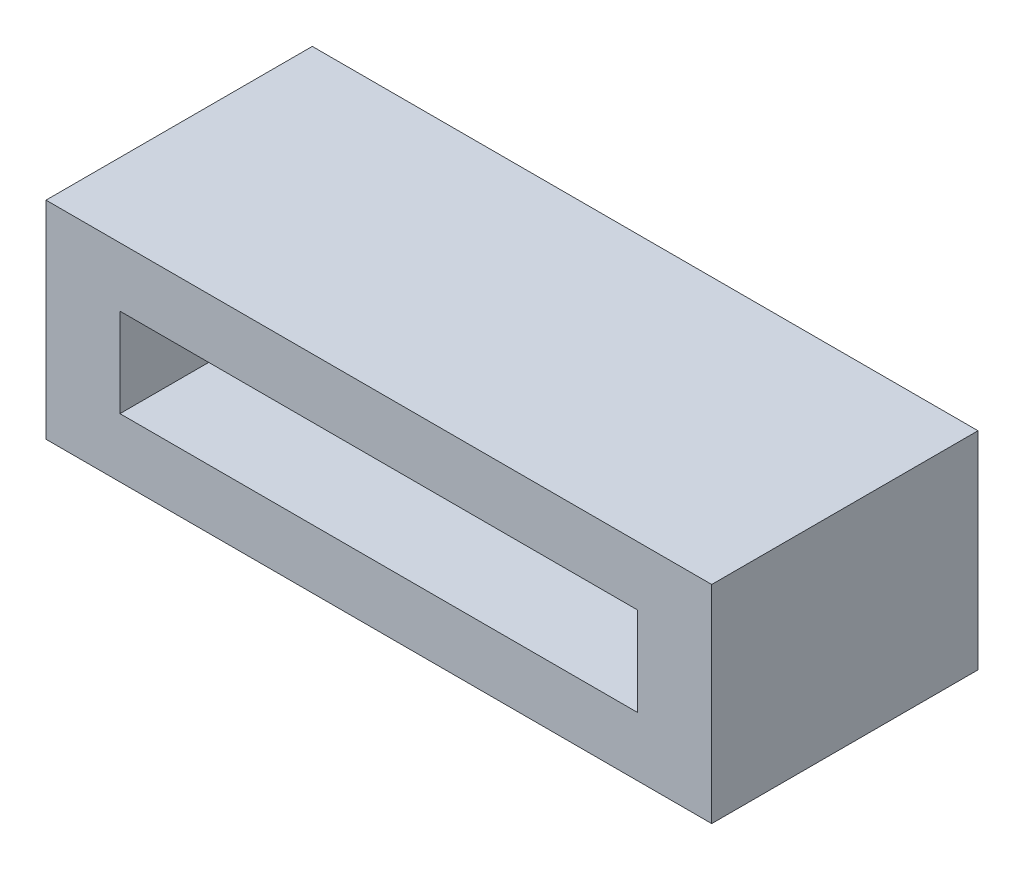
ISO-10303-21;
HEADER;
FILE_DESCRIPTION(('STEP AP214'),'2;1');
FILE_NAME('part.step','',(''),(''),'','','');
FILE_SCHEMA(('AUTOMOTIVE_DESIGN { 1 0 10303 214 1 1 1 1 }'));
ENDSEC;
DATA;
#1=APPLICATION_CONTEXT('core data for automotive mechanical design processes');
#2=APPLICATION_PROTOCOL_DEFINITION('international standard','automotive_design',2000,#1);
#3=PRODUCT_CONTEXT('',#1,'mechanical');
#4=PRODUCT('Part','Part','',(#3));
#5=PRODUCT_RELATED_PRODUCT_CATEGORY('part','',(#4));
#6=PRODUCT_DEFINITION_FORMATION('','',#4);
#7=PRODUCT_DEFINITION_CONTEXT('part definition',#1,'design');
#8=PRODUCT_DEFINITION('design','',#6,#7);
#9=PRODUCT_DEFINITION_SHAPE('','',#8);
#10=(LENGTH_UNIT() NAMED_UNIT(*) SI_UNIT(.MILLI.,.METRE.));
#11=(NAMED_UNIT(*) PLANE_ANGLE_UNIT() SI_UNIT($,.RADIAN.));
#12=(NAMED_UNIT(*) SI_UNIT($,.STERADIAN.) SOLID_ANGLE_UNIT());
#13=UNCERTAINTY_MEASURE_WITH_UNIT(LENGTH_MEASURE(1.E-05),#10,'distance_accuracy_value','');
#14=(GEOMETRIC_REPRESENTATION_CONTEXT(3) GLOBAL_UNCERTAINTY_ASSIGNED_CONTEXT((#13)) GLOBAL_UNIT_ASSIGNED_CONTEXT((#10,
#11,#12)) REPRESENTATION_CONTEXT('',''));
#15=CARTESIAN_POINT('',(0.,0.,0.));
#16=DIRECTION('',(0.,0.,1.));
#17=DIRECTION('',(1.,0.,0.));
#18=AXIS2_PLACEMENT_3D('',#15,#16,#17);
#19=CARTESIAN_POINT('',(0.,0.,18.));
#20=DIRECTION('',(0.,0.,1.));
#21=DIRECTION('',(1.,0.,0.));
#22=AXIS2_PLACEMENT_3D('',#19,#20,#21);
#23=PLANE('',#22);
#24=DIRECTION('',(0.,1.,0.));
#25=VECTOR('',#24,1.);
#26=CARTESIAN_POINT('',(22.5,6.99999999999999,18.));
#27=LINE('',#26,#25);
#28=CARTESIAN_POINT('',(22.5,-7.00000000000001,18.));
#29=VERTEX_POINT('',#28);
#30=CARTESIAN_POINT('',(22.5,6.99999999999999,18.));
#31=VERTEX_POINT('',#30);
#32=EDGE_CURVE('E134',#29,#31,#27,.T.);
#33=ORIENTED_EDGE('',*,*,#32,.T.);
#34=DIRECTION('',(-1.,0.,0.));
#35=VECTOR('',#34,1.);
#36=CARTESIAN_POINT('',(-22.5,6.99999999999999,18.));
#37=LINE('',#36,#35);
#38=CARTESIAN_POINT('',(-22.5,6.99999999999999,18.));
#39=VERTEX_POINT('',#38);
#40=EDGE_CURVE('E137',#31,#39,#37,.T.);
#41=ORIENTED_EDGE('',*,*,#40,.T.);
#42=DIRECTION('',(0.,-1.,0.));
#43=VECTOR('',#42,1.);
#44=CARTESIAN_POINT('',(-22.5,6.99999999999999,18.));
#45=LINE('',#44,#43);
#46=CARTESIAN_POINT('',(-22.5,-7.00000000000001,18.));
#47=VERTEX_POINT('',#46);
#48=EDGE_CURVE('E140',#39,#47,#45,.T.);
#49=ORIENTED_EDGE('',*,*,#48,.T.);
#50=DIRECTION('',(1.,0.,0.));
#51=VECTOR('',#50,1.);
#52=CARTESIAN_POINT('',(-22.5,-7.00000000000001,18.));
#53=LINE('',#52,#51);
#54=EDGE_CURVE('E142',#47,#29,#53,.T.);
#55=ORIENTED_EDGE('',*,*,#54,.T.);
#56=EDGE_LOOP('',(#33,#41,#49,#55));
#57=FACE_BOUND('',#56,.T.);
#58=DIRECTION('',(-1.,0.,0.));
#59=VECTOR('',#58,1.);
#60=CARTESIAN_POINT('',(-17.5,2.99999999999999,18.));
#61=LINE('',#60,#59);
#62=CARTESIAN_POINT('',(17.5,2.99999999999999,18.));
#63=VERTEX_POINT('',#62);
#64=CARTESIAN_POINT('',(-17.5,2.99999999999999,18.));
#65=VERTEX_POINT('',#64);
#66=EDGE_CURVE('E106',#63,#65,#61,.T.);
#67=ORIENTED_EDGE('',*,*,#66,.F.);
#68=DIRECTION('',(0.,1.,0.));
#69=VECTOR('',#68,1.);
#70=CARTESIAN_POINT('',(17.5,2.99999999999999,18.));
#71=LINE('',#70,#69);
#72=CARTESIAN_POINT('',(17.5,-3.00000000000001,18.));
#73=VERTEX_POINT('',#72);
#74=EDGE_CURVE('E98',#73,#63,#71,.T.);
#75=ORIENTED_EDGE('',*,*,#74,.F.);
#76=DIRECTION('',(1.,0.,0.));
#77=VECTOR('',#76,1.);
#78=CARTESIAN_POINT('',(-17.5,-3.00000000000001,18.));
#79=LINE('',#78,#77);
#80=CARTESIAN_POINT('',(-17.5,-3.00000000000001,18.));
#81=VERTEX_POINT('',#80);
#82=EDGE_CURVE('E120',#81,#73,#79,.T.);
#83=ORIENTED_EDGE('',*,*,#82,.F.);
#84=DIRECTION('',(0.,-1.,0.));
#85=VECTOR('',#84,1.);
#86=CARTESIAN_POINT('',(-17.5,2.99999999999999,18.));
#87=LINE('',#86,#85);
#88=EDGE_CURVE('E118',#65,#81,#87,.T.);
#89=ORIENTED_EDGE('',*,*,#88,.F.);
#90=EDGE_LOOP('',(#67,#75,#83,#89));
#91=FACE_BOUND('',#90,.T.);
#92=ADVANCED_FACE('F33',(#57,#91),#23,.T.);
#93=CARTESIAN_POINT('',(0.,0.,0.));
#94=DIRECTION('',(0.,0.,1.));
#95=DIRECTION('',(1.,0.,0.));
#96=AXIS2_PLACEMENT_3D('',#93,#94,#95);
#97=PLANE('',#96);
#98=DIRECTION('',(0.,1.,0.));
#99=VECTOR('',#98,1.);
#100=CARTESIAN_POINT('',(22.5,6.99999999999999,0.));
#101=LINE('',#100,#99);
#102=CARTESIAN_POINT('',(22.5,-7.00000000000001,0.));
#103=VERTEX_POINT('',#102);
#104=CARTESIAN_POINT('',(22.5,6.99999999999999,0.));
#105=VERTEX_POINT('',#104);
#106=EDGE_CURVE('E114',#103,#105,#101,.T.);
#107=ORIENTED_EDGE('',*,*,#106,.F.);
#108=DIRECTION('',(1.,0.,0.));
#109=VECTOR('',#108,1.);
#110=CARTESIAN_POINT('',(-22.5,-7.00000000000001,0.));
#111=LINE('',#110,#109);
#112=CARTESIAN_POINT('',(-22.5,-7.00000000000001,0.));
#113=VERTEX_POINT('',#112);
#114=EDGE_CURVE('E138',#113,#103,#111,.T.);
#115=ORIENTED_EDGE('',*,*,#114,.F.);
#116=DIRECTION('',(0.,-1.,0.));
#117=VECTOR('',#116,1.);
#118=CARTESIAN_POINT('',(-22.5,6.99999999999999,0.));
#119=LINE('',#118,#117);
#120=CARTESIAN_POINT('',(-22.5,6.99999999999999,0.));
#121=VERTEX_POINT('',#120);
#122=EDGE_CURVE('E149',#121,#113,#119,.T.);
#123=ORIENTED_EDGE('',*,*,#122,.F.);
#124=DIRECTION('',(-1.,0.,0.));
#125=VECTOR('',#124,1.);
#126=CARTESIAN_POINT('',(-22.5,6.99999999999999,0.));
#127=LINE('',#126,#125);
#128=EDGE_CURVE('E147',#105,#121,#127,.T.);
#129=ORIENTED_EDGE('',*,*,#128,.F.);
#130=EDGE_LOOP('',(#107,#115,#123,#129));
#131=FACE_BOUND('',#130,.T.);
#132=DIRECTION('',(0.,1.,0.));
#133=VECTOR('',#132,1.);
#134=CARTESIAN_POINT('',(17.5,2.99999999999999,0.));
#135=LINE('',#134,#133);
#136=CARTESIAN_POINT('',(17.5,-3.00000000000001,0.));
#137=VERTEX_POINT('',#136);
#138=CARTESIAN_POINT('',(17.5,2.99999999999999,0.));
#139=VERTEX_POINT('',#138);
#140=EDGE_CURVE('E56',#137,#139,#135,.T.);
#141=ORIENTED_EDGE('',*,*,#140,.T.);
#142=DIRECTION('',(-1.,0.,0.));
#143=VECTOR('',#142,1.);
#144=CARTESIAN_POINT('',(-17.5,2.99999999999999,0.));
#145=LINE('',#144,#143);
#146=CARTESIAN_POINT('',(-17.5,2.99999999999999,0.));
#147=VERTEX_POINT('',#146);
#148=EDGE_CURVE('E113',#139,#147,#145,.T.);
#149=ORIENTED_EDGE('',*,*,#148,.T.);
#150=DIRECTION('',(0.,-1.,0.));
#151=VECTOR('',#150,1.);
#152=CARTESIAN_POINT('',(-17.5,2.99999999999999,0.));
#153=LINE('',#152,#151);
#154=CARTESIAN_POINT('',(-17.5,-3.00000000000001,0.));
#155=VERTEX_POINT('',#154);
#156=EDGE_CURVE('E126',#147,#155,#153,.T.);
#157=ORIENTED_EDGE('',*,*,#156,.T.);
#158=DIRECTION('',(1.,0.,0.));
#159=VECTOR('',#158,1.);
#160=CARTESIAN_POINT('',(-17.5,-3.00000000000001,0.));
#161=LINE('',#160,#159);
#162=EDGE_CURVE('E107',#155,#137,#161,.T.);
#163=ORIENTED_EDGE('',*,*,#162,.T.);
#164=EDGE_LOOP('',(#141,#149,#157,#163));
#165=FACE_BOUND('',#164,.T.);
#166=ADVANCED_FACE('F167',(#131,#165),#97,.F.);
#167=CARTESIAN_POINT('',(22.5,6.99999999999999,18.));
#168=DIRECTION('',(-1.,0.,0.));
#169=DIRECTION('',(0.,0.,1.));
#170=AXIS2_PLACEMENT_3D('',#167,#168,#169);
#171=PLANE('',#170);
#172=ORIENTED_EDGE('',*,*,#106,.T.);
#173=DIRECTION('',(0.,0.,-1.));
#174=VECTOR('',#173,1.);
#175=CARTESIAN_POINT('',(22.5,6.99999999999999,18.));
#176=LINE('',#175,#174);
#177=EDGE_CURVE('E11',#31,#105,#176,.T.);
#178=ORIENTED_EDGE('',*,*,#177,.F.);
#179=ORIENTED_EDGE('',*,*,#32,.F.);
#180=DIRECTION('',(0.,0.,-1.));
#181=VECTOR('',#180,1.);
#182=CARTESIAN_POINT('',(22.5,-7.00000000000001,18.));
#183=LINE('',#182,#181);
#184=EDGE_CURVE('E144',#29,#103,#183,.T.);
#185=ORIENTED_EDGE('',*,*,#184,.T.);
#186=EDGE_LOOP('',(#172,#178,#179,#185));
#187=FACE_BOUND('',#186,.T.);
#188=ADVANCED_FACE('F35',(#187),#171,.F.);
#189=CARTESIAN_POINT('',(-22.5,6.99999999999999,18.));
#190=DIRECTION('',(0.,-1.,0.));
#191=DIRECTION('',(0.,0.,-1.));
#192=AXIS2_PLACEMENT_3D('',#189,#190,#191);
#193=PLANE('',#192);
#194=ORIENTED_EDGE('',*,*,#128,.T.);
#195=DIRECTION('',(0.,0.,-1.));
#196=VECTOR('',#195,1.);
#197=CARTESIAN_POINT('',(-22.5,6.99999999999999,18.));
#198=LINE('',#197,#196);
#199=EDGE_CURVE('E41',#39,#121,#198,.T.);
#200=ORIENTED_EDGE('',*,*,#199,.F.);
#201=ORIENTED_EDGE('',*,*,#40,.F.);
#202=ORIENTED_EDGE('',*,*,#177,.T.);
#203=EDGE_LOOP('',(#194,#200,#201,#202));
#204=FACE_BOUND('',#203,.T.);
#205=ADVANCED_FACE('F177',(#204),#193,.F.);
#206=CARTESIAN_POINT('',(-22.5,6.99999999999999,18.));
#207=DIRECTION('',(1.,0.,0.));
#208=DIRECTION('',(0.,0.,-1.));
#209=AXIS2_PLACEMENT_3D('',#206,#207,#208);
#210=PLANE('',#209);
#211=ORIENTED_EDGE('',*,*,#122,.T.);
#212=DIRECTION('',(0.,0.,-1.));
#213=VECTOR('',#212,1.);
#214=CARTESIAN_POINT('',(-22.5,-7.00000000000001,18.));
#215=LINE('',#214,#213);
#216=EDGE_CURVE('E154',#47,#113,#215,.T.);
#217=ORIENTED_EDGE('',*,*,#216,.F.);
#218=ORIENTED_EDGE('',*,*,#48,.F.);
#219=ORIENTED_EDGE('',*,*,#199,.T.);
#220=EDGE_LOOP('',(#211,#217,#218,#219));
#221=FACE_BOUND('',#220,.T.);
#222=ADVANCED_FACE('F161',(#221),#210,.F.);
#223=CARTESIAN_POINT('',(-22.5,-7.00000000000001,18.));
#224=DIRECTION('',(0.,1.,0.));
#225=DIRECTION('',(0.,0.,1.));
#226=AXIS2_PLACEMENT_3D('',#223,#224,#225);
#227=PLANE('',#226);
#228=ORIENTED_EDGE('',*,*,#114,.T.);
#229=ORIENTED_EDGE('',*,*,#184,.F.);
#230=ORIENTED_EDGE('',*,*,#54,.F.);
#231=ORIENTED_EDGE('',*,*,#216,.T.);
#232=EDGE_LOOP('',(#228,#229,#230,#231));
#233=FACE_BOUND('',#232,.T.);
#234=ADVANCED_FACE('F171',(#233),#227,.F.);
#235=CARTESIAN_POINT('',(17.5,2.99999999999999,18.));
#236=DIRECTION('',(-1.,0.,0.));
#237=DIRECTION('',(0.,0.,1.));
#238=AXIS2_PLACEMENT_3D('',#235,#236,#237);
#239=PLANE('',#238);
#240=ORIENTED_EDGE('',*,*,#140,.F.);
#241=DIRECTION('',(0.,0.,-1.));
#242=VECTOR('',#241,1.);
#243=CARTESIAN_POINT('',(17.5,-3.00000000000001,18.));
#244=LINE('',#243,#242);
#245=EDGE_CURVE('E102',#73,#137,#244,.T.);
#246=ORIENTED_EDGE('',*,*,#245,.F.);
#247=ORIENTED_EDGE('',*,*,#74,.T.);
#248=DIRECTION('',(0.,0.,-1.));
#249=VECTOR('',#248,1.);
#250=CARTESIAN_POINT('',(17.5,2.99999999999999,18.));
#251=LINE('',#250,#249);
#252=EDGE_CURVE('E101',#63,#139,#251,.T.);
#253=ORIENTED_EDGE('',*,*,#252,.T.);
#254=EDGE_LOOP('',(#240,#246,#247,#253));
#255=FACE_BOUND('',#254,.T.);
#256=ADVANCED_FACE('F100',(#255),#239,.T.);
#257=CARTESIAN_POINT('',(-17.5,2.99999999999999,18.));
#258=DIRECTION('',(0.,-1.,0.));
#259=DIRECTION('',(0.,0.,-1.));
#260=AXIS2_PLACEMENT_3D('',#257,#258,#259);
#261=PLANE('',#260);
#262=ORIENTED_EDGE('',*,*,#148,.F.);
#263=ORIENTED_EDGE('',*,*,#252,.F.);
#264=ORIENTED_EDGE('',*,*,#66,.T.);
#265=DIRECTION('',(0.,0.,-1.));
#266=VECTOR('',#265,1.);
#267=CARTESIAN_POINT('',(-17.5,2.99999999999999,18.));
#268=LINE('',#267,#266);
#269=EDGE_CURVE('E115',#65,#147,#268,.T.);
#270=ORIENTED_EDGE('',*,*,#269,.T.);
#271=EDGE_LOOP('',(#262,#263,#264,#270));
#272=FACE_BOUND('',#271,.T.);
#273=ADVANCED_FACE('F110',(#272),#261,.T.);
#274=CARTESIAN_POINT('',(-17.5,2.99999999999999,18.));
#275=DIRECTION('',(1.,0.,0.));
#276=DIRECTION('',(0.,0.,-1.));
#277=AXIS2_PLACEMENT_3D('',#274,#275,#276);
#278=PLANE('',#277);
#279=ORIENTED_EDGE('',*,*,#156,.F.);
#280=ORIENTED_EDGE('',*,*,#269,.F.);
#281=ORIENTED_EDGE('',*,*,#88,.T.);
#282=DIRECTION('',(0.,0.,-1.));
#283=VECTOR('',#282,1.);
#284=CARTESIAN_POINT('',(-17.5,-3.00000000000001,18.));
#285=LINE('',#284,#283);
#286=EDGE_CURVE('E48',#81,#155,#285,.T.);
#287=ORIENTED_EDGE('',*,*,#286,.T.);
#288=EDGE_LOOP('',(#279,#280,#281,#287));
#289=FACE_BOUND('',#288,.T.);
#290=ADVANCED_FACE('F200',(#289),#278,.T.);
#291=CARTESIAN_POINT('',(-17.5,-3.00000000000001,18.));
#292=DIRECTION('',(0.,1.,0.));
#293=DIRECTION('',(0.,0.,1.));
#294=AXIS2_PLACEMENT_3D('',#291,#292,#293);
#295=PLANE('',#294);
#296=ORIENTED_EDGE('',*,*,#162,.F.);
#297=ORIENTED_EDGE('',*,*,#286,.F.);
#298=ORIENTED_EDGE('',*,*,#82,.T.);
#299=ORIENTED_EDGE('',*,*,#245,.T.);
#300=EDGE_LOOP('',(#296,#297,#298,#299));
#301=FACE_BOUND('',#300,.T.);
#302=ADVANCED_FACE('F204',(#301),#295,.T.);
#303=CLOSED_SHELL('',(#92,#166,#188,#205,#222,#234,#256,#273,#290,#302));
#304=MANIFOLD_SOLID_BREP('B2',#303);
#305=ADVANCED_BREP_SHAPE_REPRESENTATION('',(#18,#304),#14);
#306=SHAPE_DEFINITION_REPRESENTATION(#9,#305);
ENDSEC;
END-ISO-10303-21;
